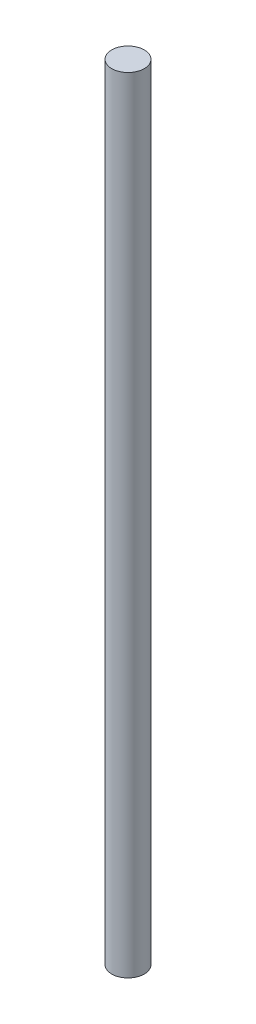
ISO-10303-21;
HEADER;
FILE_DESCRIPTION(('STEP AP214'),'2;1');
FILE_NAME('part.step','',(''),(''),'','','');
FILE_SCHEMA(('AUTOMOTIVE_DESIGN { 1 0 10303 214 1 1 1 1 }'));
ENDSEC;
DATA;
#1=APPLICATION_CONTEXT('core data for automotive mechanical design processes');
#2=APPLICATION_PROTOCOL_DEFINITION('international standard','automotive_design',2000,#1);
#3=PRODUCT_CONTEXT('',#1,'mechanical');
#4=PRODUCT('Part','Part','',(#3));
#5=PRODUCT_RELATED_PRODUCT_CATEGORY('part','',(#4));
#6=PRODUCT_DEFINITION_FORMATION('','',#4);
#7=PRODUCT_DEFINITION_CONTEXT('part definition',#1,'design');
#8=PRODUCT_DEFINITION('design','',#6,#7);
#9=PRODUCT_DEFINITION_SHAPE('','',#8);
#10=(LENGTH_UNIT() NAMED_UNIT(*) SI_UNIT(.MILLI.,.METRE.));
#11=(NAMED_UNIT(*) PLANE_ANGLE_UNIT() SI_UNIT($,.RADIAN.));
#12=(NAMED_UNIT(*) SI_UNIT($,.STERADIAN.) SOLID_ANGLE_UNIT());
#13=UNCERTAINTY_MEASURE_WITH_UNIT(LENGTH_MEASURE(1.E-05),#10,'distance_accuracy_value','');
#14=(GEOMETRIC_REPRESENTATION_CONTEXT(3) GLOBAL_UNCERTAINTY_ASSIGNED_CONTEXT((#13)) GLOBAL_UNIT_ASSIGNED_CONTEXT((#10,
#11,#12)) REPRESENTATION_CONTEXT('',''));
#15=CARTESIAN_POINT('',(0.,0.,0.));
#16=DIRECTION('',(0.,0.,1.));
#17=DIRECTION('',(1.,0.,0.));
#18=AXIS2_PLACEMENT_3D('',#15,#16,#17);
#19=CARTESIAN_POINT('',(0.,120.65,0.));
#20=DIRECTION('',(0.,-1.,0.));
#21=DIRECTION('',(0.,0.,-1.));
#22=AXIS2_PLACEMENT_3D('',#19,#20,#21);
#23=CYLINDRICAL_SURFACE('',#22,2.5);
#24=CARTESIAN_POINT('',(0.,120.65,0.));
#25=DIRECTION('',(0.,1.,0.));
#26=DIRECTION('',(0.,0.,1.));
#27=AXIS2_PLACEMENT_3D('',#24,#25,#26);
#28=CIRCLE('',#27,2.5);
#29=CARTESIAN_POINT('',(0.,120.65,-2.5));
#30=VERTEX_POINT('',#29);
#31=EDGE_CURVE('E10',#30,#30,#28,.T.);
#32=CARTESIAN_POINT('',(0.,0.,0.));
#33=DIRECTION('',(0.,1.,0.));
#34=DIRECTION('',(0.,0.,1.));
#35=AXIS2_PLACEMENT_3D('',#32,#33,#34);
#36=CIRCLE('',#35,2.5);
#37=CARTESIAN_POINT('',(0.,0.,-2.5));
#38=VERTEX_POINT('',#37);
#39=EDGE_CURVE('E33',#38,#38,#36,.T.);
#40=CARTESIAN_POINT('',(0.,120.65,-2.5));
#41=CARTESIAN_POINT('',(0.,119.393229166667,-2.5));
#42=CARTESIAN_POINT('',(0.,118.136458333333,-2.5));
#43=CARTESIAN_POINT('',(0.,115.622916666667,-2.5));
#44=CARTESIAN_POINT('',(0.,114.366145833333,-2.5));
#45=CARTESIAN_POINT('',(0.,111.852604166667,-2.5));
#46=CARTESIAN_POINT('',(0.,110.595833333333,-2.5));
#47=CARTESIAN_POINT('',(0.,108.082291666667,-2.5));
#48=CARTESIAN_POINT('',(0.,106.825520833333,-2.5));
#49=CARTESIAN_POINT('',(0.,104.311979166667,-2.5));
#50=CARTESIAN_POINT('',(0.,103.055208333333,-2.5));
#51=CARTESIAN_POINT('',(0.,100.541666666667,-2.5));
#52=CARTESIAN_POINT('',(0.,99.2848958333333,-2.5));
#53=CARTESIAN_POINT('',(0.,96.7713541666667,-2.5));
#54=CARTESIAN_POINT('',(0.,95.5145833333333,-2.5));
#55=CARTESIAN_POINT('',(0.,93.0010416666667,-2.5));
#56=CARTESIAN_POINT('',(0.,91.7442708333333,-2.5));
#57=CARTESIAN_POINT('',(0.,89.2307291666666,-2.5));
#58=CARTESIAN_POINT('',(0.,87.9739583333333,-2.5));
#59=CARTESIAN_POINT('',(0.,85.4604166666666,-2.5));
#60=CARTESIAN_POINT('',(0.,84.2036458333333,-2.5));
#61=CARTESIAN_POINT('',(0.,81.6901041666667,-2.5));
#62=CARTESIAN_POINT('',(0.,80.4333333333333,-2.5));
#63=CARTESIAN_POINT('',(0.,77.9197916666667,-2.5));
#64=CARTESIAN_POINT('',(0.,76.6630208333333,-2.5));
#65=CARTESIAN_POINT('',(0.,74.1494791666667,-2.5));
#66=CARTESIAN_POINT('',(0.,72.8927083333333,-2.5));
#67=CARTESIAN_POINT('',(0.,70.3791666666667,-2.5));
#68=CARTESIAN_POINT('',(0.,69.1223958333333,-2.5));
#69=CARTESIAN_POINT('',(0.,66.6088541666666,-2.5));
#70=CARTESIAN_POINT('',(0.,65.3520833333333,-2.5));
#71=CARTESIAN_POINT('',(0.,62.8385416666667,-2.5));
#72=CARTESIAN_POINT('',(0.,61.5817708333333,-2.5));
#73=CARTESIAN_POINT('',(0.,59.0682291666667,-2.5));
#74=CARTESIAN_POINT('',(0.,57.8114583333333,-2.5));
#75=CARTESIAN_POINT('',(0.,55.2979166666667,-2.5));
#76=CARTESIAN_POINT('',(0.,54.0411458333333,-2.5));
#77=CARTESIAN_POINT('',(0.,51.5276041666667,-2.5));
#78=CARTESIAN_POINT('',(0.,50.2708333333333,-2.5));
#79=CARTESIAN_POINT('',(0.,47.7572916666667,-2.5));
#80=CARTESIAN_POINT('',(0.,46.5005208333333,-2.5));
#81=CARTESIAN_POINT('',(0.,43.9869791666667,-2.5));
#82=CARTESIAN_POINT('',(0.,42.7302083333333,-2.5));
#83=CARTESIAN_POINT('',(0.,40.2166666666667,-2.5));
#84=CARTESIAN_POINT('',(0.,38.9598958333333,-2.5));
#85=CARTESIAN_POINT('',(0.,36.4463541666667,-2.5));
#86=CARTESIAN_POINT('',(0.,35.1895833333333,-2.5));
#87=CARTESIAN_POINT('',(0.,32.6760416666667,-2.5));
#88=CARTESIAN_POINT('',(0.,31.4192708333333,-2.5));
#89=CARTESIAN_POINT('',(0.,28.9057291666667,-2.5));
#90=CARTESIAN_POINT('',(0.,27.6489583333333,-2.5));
#91=CARTESIAN_POINT('',(0.,25.1354166666667,-2.5));
#92=CARTESIAN_POINT('',(0.,23.8786458333333,-2.5));
#93=CARTESIAN_POINT('',(0.,21.3651041666667,-2.5));
#94=CARTESIAN_POINT('',(0.,20.1083333333333,-2.5));
#95=CARTESIAN_POINT('',(0.,17.5947916666667,-2.5));
#96=CARTESIAN_POINT('',(0.,16.3380208333333,-2.5));
#97=CARTESIAN_POINT('',(0.,13.8244791666667,-2.5));
#98=CARTESIAN_POINT('',(0.,12.5677083333333,-2.5));
#99=CARTESIAN_POINT('',(0.,10.0541666666667,-2.5));
#100=CARTESIAN_POINT('',(0.,8.79739583333333,-2.5));
#101=CARTESIAN_POINT('',(0.,6.28385416666666,-2.5));
#102=CARTESIAN_POINT('',(0.,5.02708333333333,-2.5));
#103=CARTESIAN_POINT('',(0.,2.51354166666666,-2.5));
#104=CARTESIAN_POINT('',(0.,1.25677083333333,-2.5));
#105=CARTESIAN_POINT('',(0.,0.,-2.5));
#106=B_SPLINE_CURVE_WITH_KNOTS('',3,(#40,#41,#42,#43,#44,#45,#46,#47,#48,#49,#50,#51,#52,#53,
#54,#55,#56,#57,#58,#59,#60,#61,#62,#63,#64,#65,#66,#67,#68,#69,#70,#71,#72,#73,#74,#75,#76,#77,
#78,#79,#80,#81,#82,#83,#84,#85,#86,#87,#88,#89,#90,#91,#92,#93,#94,#95,#96,#97,#98,#99,#100,
#101,#102,#103,#104,#105),.UNSPECIFIED.,.F.,.F.,(4,2,2,2,2,2,2,2,2,2,2,2,2,2,2,2,2,2,2,2,2,2,2,
2,2,2,2,2,2,2,2,2,4),(0.,3.77031250000001,7.54062500000001,11.3109375,15.08125,18.8515625,
22.621875,26.3921875,30.1625,33.9328125,37.703125,41.4734375,45.24375,49.0140625,52.784375,
56.5546875,60.325,64.0953125,67.865625,71.6359375,75.40625,79.1765625,82.946875,86.7171875,
90.4875,94.2578125,98.028125,101.7984375,105.56875,109.3390625,113.109375,116.8796875,120.65),.UNSPECIFIED.);
#107=EDGE_CURVE('BSEAM30',#30,#38,#106,.T.);
#108=ORIENTED_EDGE('',*,*,#31,.F.);
#109=ORIENTED_EDGE('',*,*,#39,.T.);
#110=ORIENTED_EDGE('',*,*,#107,.T.);
#111=ORIENTED_EDGE('',*,*,#107,.F.);
#112=EDGE_LOOP('',(#108,#110,#109,#111));
#113=FACE_BOUND('',#112,.T.);
#114=ADVANCED_FACE('F30',(#113),#23,.T.);
#115=CARTESIAN_POINT('',(0.,120.65,0.));
#116=DIRECTION('',(0.,1.,0.));
#117=DIRECTION('',(0.,0.,1.));
#118=AXIS2_PLACEMENT_3D('',#115,#116,#117);
#119=PLANE('',#118);
#120=ORIENTED_EDGE('',*,*,#31,.T.);
#121=EDGE_LOOP('',(#120));
#122=FACE_BOUND('',#121,.T.);
#123=ADVANCED_FACE('F45',(#122),#119,.T.);
#124=CARTESIAN_POINT('',(0.,0.,0.));
#125=DIRECTION('',(0.,1.,0.));
#126=DIRECTION('',(0.,0.,1.));
#127=AXIS2_PLACEMENT_3D('',#124,#125,#126);
#128=PLANE('',#127);
#129=ORIENTED_EDGE('',*,*,#39,.F.);
#130=EDGE_LOOP('',(#129));
#131=FACE_BOUND('',#130,.T.);
#132=ADVANCED_FACE('F43',(#131),#128,.F.);
#133=CLOSED_SHELL('',(#114,#123,#132));
#134=MANIFOLD_SOLID_BREP('B2',#133);
#135=ADVANCED_BREP_SHAPE_REPRESENTATION('',(#18,#134),#14);
#136=SHAPE_DEFINITION_REPRESENTATION(#9,#135);
ENDSEC;
END-ISO-10303-21;
